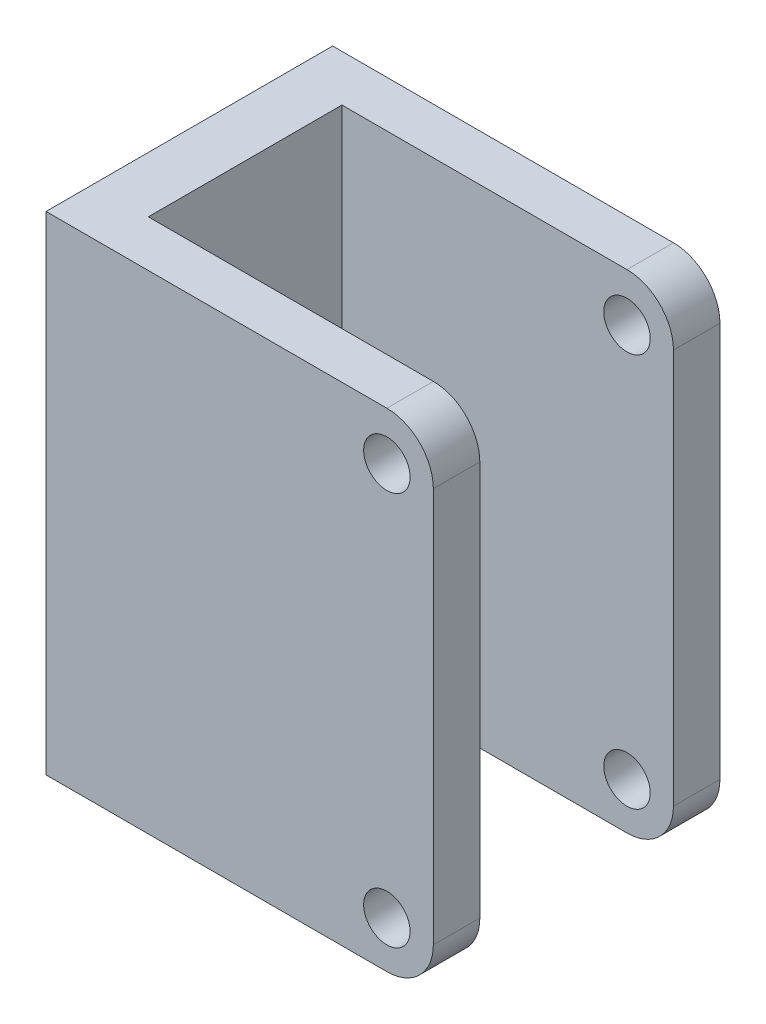
ISO-10303-21;
HEADER;
FILE_DESCRIPTION(('STEP AP214'),'2;1');
FILE_NAME('part.step','',(''),(''),'','','');
FILE_SCHEMA(('AUTOMOTIVE_DESIGN { 1 0 10303 214 1 1 1 1 }'));
ENDSEC;
DATA;
#1=APPLICATION_CONTEXT('core data for automotive mechanical design processes');
#2=APPLICATION_PROTOCOL_DEFINITION('international standard','automotive_design',2000,#1);
#3=PRODUCT_CONTEXT('',#1,'mechanical');
#4=PRODUCT('Part','Part','',(#3));
#5=PRODUCT_RELATED_PRODUCT_CATEGORY('part','',(#4));
#6=PRODUCT_DEFINITION_FORMATION('','',#4);
#7=PRODUCT_DEFINITION_CONTEXT('part definition',#1,'design');
#8=PRODUCT_DEFINITION('design','',#6,#7);
#9=PRODUCT_DEFINITION_SHAPE('','',#8);
#10=(LENGTH_UNIT() NAMED_UNIT(*) SI_UNIT(.MILLI.,.METRE.));
#11=(NAMED_UNIT(*) PLANE_ANGLE_UNIT() SI_UNIT($,.RADIAN.));
#12=(NAMED_UNIT(*) SI_UNIT($,.STERADIAN.) SOLID_ANGLE_UNIT());
#13=UNCERTAINTY_MEASURE_WITH_UNIT(LENGTH_MEASURE(1.E-05),#10,'distance_accuracy_value','');
#14=(GEOMETRIC_REPRESENTATION_CONTEXT(3) GLOBAL_UNCERTAINTY_ASSIGNED_CONTEXT((#13)) GLOBAL_UNIT_ASSIGNED_CONTEXT((#10,
#11,#12)) REPRESENTATION_CONTEXT('',''));
#15=CARTESIAN_POINT('',(0.,0.,0.));
#16=DIRECTION('',(0.,0.,1.));
#17=DIRECTION('',(1.,0.,0.));
#18=AXIS2_PLACEMENT_3D('',#15,#16,#17);
#19=CARTESIAN_POINT('',(-18.4575144066164,-16.4787543655413,12.0000000000001));
#20=DIRECTION('',(0.,0.,1.));
#21=DIRECTION('',(1.,0.,0.));
#22=AXIS2_PLACEMENT_3D('',#19,#20,#21);
#23=PLANE('',#22);
#24=CARTESIAN_POINT('',(-18.4575144066164,-16.4787543655413,12.0000000000001));
#25=DIRECTION('',(0.,0.,1.));
#26=DIRECTION('',(1.,0.,0.));
#27=AXIS2_PLACEMENT_3D('',#24,#25,#26);
#28=CIRCLE('',#27,3.);
#29=CARTESIAN_POINT('',(-18.4575144066164,-19.4787543655413,12.0000000000001));
#30=VERTEX_POINT('',#29);
#31=CARTESIAN_POINT('',(-15.4575144066164,-16.4787543655413,12.0000000000001));
#32=VERTEX_POINT('',#31);
#33=EDGE_CURVE('E129',#30,#32,#28,.T.);
#34=ORIENTED_EDGE('',*,*,#33,.F.);
#35=DIRECTION('',(1.,0.,0.));
#36=VECTOR('',#35,1.);
#37=CARTESIAN_POINT('',(-40.4575144066164,-19.4787543655413,12.0000000000001));
#38=LINE('',#37,#36);
#39=CARTESIAN_POINT('',(-36.8575144066164,-19.4787543655413,12.0000000000001));
#40=VERTEX_POINT('',#39);
#41=EDGE_CURVE('E127',#40,#30,#38,.T.);
#42=ORIENTED_EDGE('',*,*,#41,.F.);
#43=DIRECTION('',(0.,-1.,0.));
#44=VECTOR('',#43,1.);
#45=CARTESIAN_POINT('',(-36.8575144066164,-19.4787543655413,12.0000000000001));
#46=LINE('',#45,#44);
#47=CARTESIAN_POINT('',(-36.8575144066164,12.0212456344587,12.0000000000001));
#48=VERTEX_POINT('',#47);
#49=EDGE_CURVE('E148',#48,#40,#46,.T.);
#50=ORIENTED_EDGE('',*,*,#49,.F.);
#51=DIRECTION('',(-1.,0.,0.));
#52=VECTOR('',#51,1.);
#53=CARTESIAN_POINT('',(-18.4575144066164,12.0212456344587,12.0000000000001));
#54=LINE('',#53,#52);
#55=CARTESIAN_POINT('',(-18.4575144066164,12.0212456344587,12.0000000000001));
#56=VERTEX_POINT('',#55);
#57=EDGE_CURVE('E55',#56,#48,#54,.T.);
#58=ORIENTED_EDGE('',*,*,#57,.F.);
#59=CARTESIAN_POINT('',(-18.4575144066163,9.02124563445868,12.0000000000001));
#60=DIRECTION('',(0.,0.,1.));
#61=DIRECTION('',(1.,0.,0.));
#62=AXIS2_PLACEMENT_3D('',#59,#60,#61);
#63=CIRCLE('',#62,3.);
#64=CARTESIAN_POINT('',(-15.4575144066163,9.02124563445866,12.0000000000001));
#65=VERTEX_POINT('',#64);
#66=EDGE_CURVE('E86',#65,#56,#63,.T.);
#67=ORIENTED_EDGE('',*,*,#66,.F.);
#68=DIRECTION('',(0.,1.,0.));
#69=VECTOR('',#68,1.);
#70=CARTESIAN_POINT('',(-15.4575144066164,-16.4787543655413,12.0000000000001));
#71=LINE('',#70,#69);
#72=EDGE_CURVE('E117',#32,#65,#71,.T.);
#73=ORIENTED_EDGE('',*,*,#72,.F.);
#74=EDGE_LOOP('',(#34,#42,#50,#58,#67,#73));
#75=FACE_BOUND('',#74,.T.);
#76=CARTESIAN_POINT('',(-18.4575144066163,-16.4787543655413,12.0000000000001));
#77=DIRECTION('',(0.,0.,1.));
#78=DIRECTION('',(1.,0.,0.));
#79=AXIS2_PLACEMENT_3D('',#76,#77,#78);
#80=CIRCLE('',#79,1.5);
#81=CARTESIAN_POINT('',(-16.9575144066163,-16.4787543655413,12.0000000000001));
#82=VERTEX_POINT('',#81);
#83=EDGE_CURVE('E170',#82,#82,#80,.T.);
#84=ORIENTED_EDGE('',*,*,#83,.T.);
#85=EDGE_LOOP('',(#84));
#86=FACE_BOUND('',#85,.T.);
#87=CARTESIAN_POINT('',(-18.4575144066163,8.92124563445868,12.0000000000001));
#88=DIRECTION('',(0.,0.,1.));
#89=DIRECTION('',(1.,0.,0.));
#90=AXIS2_PLACEMENT_3D('',#87,#88,#89);
#91=CIRCLE('',#90,1.5);
#92=CARTESIAN_POINT('',(-16.9575144066163,8.92124563445868,12.0000000000001));
#93=VERTEX_POINT('',#92);
#94=EDGE_CURVE('E152',#93,#93,#91,.T.);
#95=ORIENTED_EDGE('',*,*,#94,.T.);
#96=EDGE_LOOP('',(#95));
#97=FACE_BOUND('',#96,.T.);
#98=ADVANCED_FACE('F40',(#75,#86,#97),#23,.F.);
#99=CARTESIAN_POINT('',(-18.4575144066164,-16.4787543655413,15.0000000000001));
#100=DIRECTION('',(0.,0.,1.));
#101=DIRECTION('',(1.,0.,0.));
#102=AXIS2_PLACEMENT_3D('',#99,#100,#101);
#103=PLANE('',#102);
#104=CARTESIAN_POINT('',(-18.4575144066163,-16.4787543655413,15.0000000000001));
#105=DIRECTION('',(0.,0.,1.));
#106=DIRECTION('',(1.,0.,0.));
#107=AXIS2_PLACEMENT_3D('',#104,#105,#106);
#108=CIRCLE('',#107,1.5);
#109=CARTESIAN_POINT('',(-16.9575144066163,-16.4787543655413,15.0000000000001));
#110=VERTEX_POINT('',#109);
#111=EDGE_CURVE('E130',#110,#110,#108,.T.);
#112=ORIENTED_EDGE('',*,*,#111,.F.);
#113=EDGE_LOOP('',(#112));
#114=FACE_BOUND('',#113,.T.);
#115=DIRECTION('',(0.,-1.,0.));
#116=VECTOR('',#115,1.);
#117=CARTESIAN_POINT('',(-40.4575144066164,12.0212456344587,15.0000000000001));
#118=LINE('',#117,#116);
#119=CARTESIAN_POINT('',(-40.4575144066164,12.0212456344587,15.0000000000001));
#120=VERTEX_POINT('',#119);
#121=CARTESIAN_POINT('',(-40.4575144066164,-19.4787543655413,15.0000000000001));
#122=VERTEX_POINT('',#121);
#123=EDGE_CURVE('E135',#120,#122,#118,.T.);
#124=ORIENTED_EDGE('',*,*,#123,.T.);
#125=DIRECTION('',(1.,0.,0.));
#126=VECTOR('',#125,1.);
#127=CARTESIAN_POINT('',(-40.4575144066164,-19.4787543655413,15.0000000000001));
#128=LINE('',#127,#126);
#129=CARTESIAN_POINT('',(-18.4575144066164,-19.4787543655413,15.0000000000001));
#130=VERTEX_POINT('',#129);
#131=EDGE_CURVE('E93',#122,#130,#128,.T.);
#132=ORIENTED_EDGE('',*,*,#131,.T.);
#133=CARTESIAN_POINT('',(-18.4575144066164,-16.4787543655413,15.0000000000001));
#134=DIRECTION('',(0.,0.,1.));
#135=DIRECTION('',(1.,0.,0.));
#136=AXIS2_PLACEMENT_3D('',#133,#134,#135);
#137=CIRCLE('',#136,3.);
#138=CARTESIAN_POINT('',(-15.4575144066164,-16.4787543655413,15.0000000000001));
#139=VERTEX_POINT('',#138);
#140=EDGE_CURVE('E109',#130,#139,#137,.T.);
#141=ORIENTED_EDGE('',*,*,#140,.T.);
#142=DIRECTION('',(0.,1.,0.));
#143=VECTOR('',#142,1.);
#144=CARTESIAN_POINT('',(-15.4575144066164,-16.4787543655413,15.0000000000001));
#145=LINE('',#144,#143);
#146=CARTESIAN_POINT('',(-15.4575144066163,9.02124563445866,15.0000000000001));
#147=VERTEX_POINT('',#146);
#148=EDGE_CURVE('E102',#139,#147,#145,.T.);
#149=ORIENTED_EDGE('',*,*,#148,.T.);
#150=CARTESIAN_POINT('',(-18.4575144066163,9.02124563445868,15.0000000000001));
#151=DIRECTION('',(0.,0.,1.));
#152=DIRECTION('',(1.,0.,0.));
#153=AXIS2_PLACEMENT_3D('',#150,#151,#152);
#154=CIRCLE('',#153,3.);
#155=CARTESIAN_POINT('',(-18.4575144066164,12.0212456344587,15.0000000000001));
#156=VERTEX_POINT('',#155);
#157=EDGE_CURVE('E107',#147,#156,#154,.T.);
#158=ORIENTED_EDGE('',*,*,#157,.T.);
#159=DIRECTION('',(-1.,0.,0.));
#160=VECTOR('',#159,1.);
#161=CARTESIAN_POINT('',(-18.4575144066164,12.0212456344587,15.0000000000001));
#162=LINE('',#161,#160);
#163=EDGE_CURVE('E64',#156,#120,#162,.T.);
#164=ORIENTED_EDGE('',*,*,#163,.T.);
#165=EDGE_LOOP('',(#124,#132,#141,#149,#158,#164));
#166=FACE_BOUND('',#165,.T.);
#167=CARTESIAN_POINT('',(-18.4575144066163,8.92124563445868,15.0000000000001));
#168=DIRECTION('',(0.,0.,1.));
#169=DIRECTION('',(1.,0.,0.));
#170=AXIS2_PLACEMENT_3D('',#167,#168,#169);
#171=CIRCLE('',#170,1.5);
#172=CARTESIAN_POINT('',(-16.9575144066163,8.92124563445868,15.0000000000001));
#173=VERTEX_POINT('',#172);
#174=EDGE_CURVE('E167',#173,#173,#171,.T.);
#175=ORIENTED_EDGE('',*,*,#174,.F.);
#176=EDGE_LOOP('',(#175));
#177=FACE_BOUND('',#176,.T.);
#178=ADVANCED_FACE('F104',(#114,#166,#177),#103,.T.);
#179=CARTESIAN_POINT('',(-40.4575144066164,12.0212456344587,15.0000000000001));
#180=DIRECTION('',(1.,0.,0.));
#181=DIRECTION('',(0.,0.,-1.));
#182=AXIS2_PLACEMENT_3D('',#179,#180,#181);
#183=PLANE('',#182);
#184=DIRECTION('',(0.,0.,-1.));
#185=VECTOR('',#184,1.);
#186=CARTESIAN_POINT('',(-40.4575144066164,12.0212456344587,15.0000000000001));
#187=LINE('',#186,#185);
#188=CARTESIAN_POINT('',(-40.4575144066164,12.0212456344587,-3.49999999999986));
#189=VERTEX_POINT('',#188);
#190=EDGE_CURVE('E123',#120,#189,#187,.T.);
#191=ORIENTED_EDGE('',*,*,#190,.T.);
#192=DIRECTION('',(0.,-1.,0.));
#193=VECTOR('',#192,1.);
#194=CARTESIAN_POINT('',(-40.4575144066164,12.0212456344587,-3.49999999999986));
#195=LINE('',#194,#193);
#196=CARTESIAN_POINT('',(-40.4575144066164,-19.4787543655413,-3.49999999999986));
#197=VERTEX_POINT('',#196);
#198=EDGE_CURVE('E184',#189,#197,#195,.T.);
#199=ORIENTED_EDGE('',*,*,#198,.T.);
#200=DIRECTION('',(0.,0.,-1.));
#201=VECTOR('',#200,1.);
#202=CARTESIAN_POINT('',(-40.4575144066164,-19.4787543655413,15.0000000000001));
#203=LINE('',#202,#201);
#204=EDGE_CURVE('E11',#122,#197,#203,.T.);
#205=ORIENTED_EDGE('',*,*,#204,.F.);
#206=ORIENTED_EDGE('',*,*,#123,.F.);
#207=EDGE_LOOP('',(#191,#199,#205,#206));
#208=FACE_BOUND('',#207,.T.);
#209=ADVANCED_FACE('F42',(#208),#183,.F.);
#210=CARTESIAN_POINT('',(-40.4575144066164,-19.4787543655413,15.0000000000001));
#211=DIRECTION('',(0.,1.,0.));
#212=DIRECTION('',(0.,0.,1.));
#213=AXIS2_PLACEMENT_3D('',#210,#211,#212);
#214=PLANE('',#213);
#215=ORIENTED_EDGE('',*,*,#204,.T.);
#216=DIRECTION('',(1.,0.,0.));
#217=VECTOR('',#216,1.);
#218=CARTESIAN_POINT('',(-40.4575144066164,-19.4787543655413,-3.49999999999986));
#219=LINE('',#218,#217);
#220=CARTESIAN_POINT('',(-18.4575144066164,-19.4787543655413,-3.49999999999986));
#221=VERTEX_POINT('',#220);
#222=EDGE_CURVE('E190',#197,#221,#219,.T.);
#223=ORIENTED_EDGE('',*,*,#222,.T.);
#224=DIRECTION('',(0.,0.,1.));
#225=VECTOR('',#224,1.);
#226=CARTESIAN_POINT('',(-18.4575144066164,-19.4787543655413,-3.49999999999986));
#227=LINE('',#226,#225);
#228=CARTESIAN_POINT('',(-18.4575144066164,-19.4787543655413,-0.499999999999865));
#229=VERTEX_POINT('',#228);
#230=EDGE_CURVE('E216',#221,#229,#227,.T.);
#231=ORIENTED_EDGE('',*,*,#230,.T.);
#232=DIRECTION('',(1.,0.,0.));
#233=VECTOR('',#232,1.);
#234=CARTESIAN_POINT('',(-40.4575144066164,-19.4787543655413,-0.499999999999865));
#235=LINE('',#234,#233);
#236=CARTESIAN_POINT('',(-36.8575144066164,-19.4787543655413,-0.499999999999865));
#237=VERTEX_POINT('',#236);
#238=EDGE_CURVE('E217',#237,#229,#235,.T.);
#239=ORIENTED_EDGE('',*,*,#238,.F.);
#240=DIRECTION('',(0.,0.,1.));
#241=VECTOR('',#240,1.);
#242=CARTESIAN_POINT('',(-36.8575144066164,-19.4787543655413,-500000.));
#243=LINE('',#242,#241);
#244=EDGE_CURVE('E153',#237,#40,#243,.T.);
#245=ORIENTED_EDGE('',*,*,#244,.T.);
#246=ORIENTED_EDGE('',*,*,#41,.T.);
#247=DIRECTION('',(0.,0.,-1.));
#248=VECTOR('',#247,1.);
#249=CARTESIAN_POINT('',(-18.4575144066164,-19.4787543655413,15.0000000000001));
#250=LINE('',#249,#248);
#251=EDGE_CURVE('E48',#130,#30,#250,.T.);
#252=ORIENTED_EDGE('',*,*,#251,.F.);
#253=ORIENTED_EDGE('',*,*,#131,.F.);
#254=EDGE_LOOP('',(#215,#223,#231,#239,#245,#246,#252,#253));
#255=FACE_BOUND('',#254,.T.);
#256=ADVANCED_FACE('F187',(#255),#214,.F.);
#257=CARTESIAN_POINT('',(-18.4575144066164,-16.4787543655413,15.0000000000001));
#258=DIRECTION('',(0.,0.,-1.));
#259=DIRECTION('',(-1.,0.,0.));
#260=AXIS2_PLACEMENT_3D('',#257,#258,#259);
#261=CYLINDRICAL_SURFACE('',#260,3.);
#262=ORIENTED_EDGE('',*,*,#33,.T.);
#263=DIRECTION('',(0.,0.,-1.));
#264=VECTOR('',#263,1.);
#265=CARTESIAN_POINT('',(-15.4575144066164,-16.4787543655413,15.0000000000001));
#266=LINE('',#265,#264);
#267=EDGE_CURVE('E118',#139,#32,#266,.T.);
#268=ORIENTED_EDGE('',*,*,#267,.F.);
#269=ORIENTED_EDGE('',*,*,#140,.F.);
#270=ORIENTED_EDGE('',*,*,#251,.T.);
#271=EDGE_LOOP('',(#262,#268,#269,#270));
#272=FACE_BOUND('',#271,.T.);
#273=ADVANCED_FACE('F142',(#272),#261,.T.);
#274=CARTESIAN_POINT('',(-15.4575144066164,-16.4787543655413,15.0000000000001));
#275=DIRECTION('',(-1.,0.,0.));
#276=DIRECTION('',(0.,-1.,0.));
#277=AXIS2_PLACEMENT_3D('',#274,#275,#276);
#278=PLANE('',#277);
#279=ORIENTED_EDGE('',*,*,#72,.T.);
#280=DIRECTION('',(0.,0.,-1.));
#281=VECTOR('',#280,1.);
#282=CARTESIAN_POINT('',(-15.4575144066163,9.02124563445866,15.0000000000001));
#283=LINE('',#282,#281);
#284=EDGE_CURVE('E114',#147,#65,#283,.T.);
#285=ORIENTED_EDGE('',*,*,#284,.F.);
#286=ORIENTED_EDGE('',*,*,#148,.F.);
#287=ORIENTED_EDGE('',*,*,#267,.T.);
#288=EDGE_LOOP('',(#279,#285,#286,#287));
#289=FACE_BOUND('',#288,.T.);
#290=ADVANCED_FACE('F115',(#289),#278,.F.);
#291=CARTESIAN_POINT('',(-18.4575144066163,9.02124563445868,15.0000000000001));
#292=DIRECTION('',(0.,0.,-1.));
#293=DIRECTION('',(-1.,0.,0.));
#294=AXIS2_PLACEMENT_3D('',#291,#292,#293);
#295=CYLINDRICAL_SURFACE('',#294,3.);
#296=ORIENTED_EDGE('',*,*,#66,.T.);
#297=DIRECTION('',(0.,0.,-1.));
#298=VECTOR('',#297,1.);
#299=CARTESIAN_POINT('',(-18.4575144066164,12.0212456344587,15.0000000000001));
#300=LINE('',#299,#298);
#301=EDGE_CURVE('E119',#156,#56,#300,.T.);
#302=ORIENTED_EDGE('',*,*,#301,.F.);
#303=ORIENTED_EDGE('',*,*,#157,.F.);
#304=ORIENTED_EDGE('',*,*,#284,.T.);
#305=EDGE_LOOP('',(#296,#302,#303,#304));
#306=FACE_BOUND('',#305,.T.);
#307=ADVANCED_FACE('F121',(#306),#295,.T.);
#308=CARTESIAN_POINT('',(-18.4575144066164,12.0212456344587,15.0000000000001));
#309=DIRECTION('',(0.,-1.,0.));
#310=DIRECTION('',(1.,0.,0.));
#311=AXIS2_PLACEMENT_3D('',#308,#309,#310);
#312=PLANE('',#311);
#313=ORIENTED_EDGE('',*,*,#57,.T.);
#314=DIRECTION('',(0.,0.,1.));
#315=VECTOR('',#314,1.);
#316=CARTESIAN_POINT('',(-36.8575144066164,12.0212456344587,-500000.));
#317=LINE('',#316,#315);
#318=CARTESIAN_POINT('',(-36.8575144066164,12.0212456344587,-0.499999999988177));
#319=VERTEX_POINT('',#318);
#320=EDGE_CURVE('E156',#319,#48,#317,.T.);
#321=ORIENTED_EDGE('',*,*,#320,.F.);
#322=DIRECTION('',(-1.,0.,0.));
#323=VECTOR('',#322,1.);
#324=CARTESIAN_POINT('',(-18.4575144066164,12.0212456344587,-0.499999999999865));
#325=LINE('',#324,#323);
#326=CARTESIAN_POINT('',(-18.4575144066164,12.0212456344587,-0.499999999999865));
#327=VERTEX_POINT('',#326);
#328=EDGE_CURVE('E205',#327,#319,#325,.T.);
#329=ORIENTED_EDGE('',*,*,#328,.F.);
#330=DIRECTION('',(0.,0.,1.));
#331=VECTOR('',#330,1.);
#332=CARTESIAN_POINT('',(-18.4575144066164,12.0212456344587,-3.49999999999986));
#333=LINE('',#332,#331);
#334=CARTESIAN_POINT('',(-18.4575144066164,12.0212456344587,-3.49999999999986));
#335=VERTEX_POINT('',#334);
#336=EDGE_CURVE('E164',#335,#327,#333,.T.);
#337=ORIENTED_EDGE('',*,*,#336,.F.);
#338=DIRECTION('',(-1.,0.,0.));
#339=VECTOR('',#338,1.);
#340=CARTESIAN_POINT('',(-18.4575144066164,12.0212456344587,-3.49999999999986));
#341=LINE('',#340,#339);
#342=EDGE_CURVE('E214',#335,#189,#341,.T.);
#343=ORIENTED_EDGE('',*,*,#342,.T.);
#344=ORIENTED_EDGE('',*,*,#190,.F.);
#345=ORIENTED_EDGE('',*,*,#163,.F.);
#346=ORIENTED_EDGE('',*,*,#301,.T.);
#347=EDGE_LOOP('',(#313,#321,#329,#337,#343,#344,#345,#346));
#348=FACE_BOUND('',#347,.T.);
#349=ADVANCED_FACE('F261',(#348),#312,.F.);
#350=CARTESIAN_POINT('',(-18.4575144066163,-16.4787543655413,15.0000000000001));
#351=DIRECTION('',(0.,0.,-1.));
#352=DIRECTION('',(-1.,0.,0.));
#353=AXIS2_PLACEMENT_3D('',#350,#351,#352);
#354=CYLINDRICAL_SURFACE('',#353,1.5);
#355=ORIENTED_EDGE('',*,*,#111,.T.);
#356=EDGE_LOOP('',(#355));
#357=FACE_BOUND('',#356,.T.);
#358=ORIENTED_EDGE('',*,*,#83,.F.);
#359=EDGE_LOOP('',(#358));
#360=FACE_BOUND('',#359,.T.);
#361=ADVANCED_FACE('F295',(#357,#360),#354,.F.);
#362=CARTESIAN_POINT('',(-18.4575144066163,8.92124563445868,15.0000000000001));
#363=DIRECTION('',(0.,0.,-1.));
#364=DIRECTION('',(-1.,0.,0.));
#365=AXIS2_PLACEMENT_3D('',#362,#363,#364);
#366=CYLINDRICAL_SURFACE('',#365,1.5);
#367=ORIENTED_EDGE('',*,*,#174,.T.);
#368=EDGE_LOOP('',(#367));
#369=FACE_BOUND('',#368,.T.);
#370=ORIENTED_EDGE('',*,*,#94,.F.);
#371=EDGE_LOOP('',(#370));
#372=FACE_BOUND('',#371,.T.);
#373=ADVANCED_FACE('F314',(#369,#372),#366,.F.);
#374=CARTESIAN_POINT('',(-36.8575144066164,-19.4787543655413,-500000.));
#375=DIRECTION('',(-1.,0.,0.));
#376=DIRECTION('',(0.,0.,1.));
#377=AXIS2_PLACEMENT_3D('',#374,#375,#376);
#378=PLANE('',#377);
#379=ORIENTED_EDGE('',*,*,#244,.F.);
#380=DIRECTION('',(0.,1.,0.));
#381=VECTOR('',#380,1.);
#382=CARTESIAN_POINT('',(-36.8575144066164,-19.4787543655413,-0.499999999988177));
#383=LINE('',#382,#381);
#384=EDGE_CURVE('E160',#237,#319,#383,.T.);
#385=ORIENTED_EDGE('',*,*,#384,.T.);
#386=ORIENTED_EDGE('',*,*,#320,.T.);
#387=ORIENTED_EDGE('',*,*,#49,.T.);
#388=EDGE_LOOP('',(#379,#385,#386,#387));
#389=FACE_BOUND('',#388,.T.);
#390=ADVANCED_FACE('F157',(#389),#378,.F.);
#391=CARTESIAN_POINT('',(-18.4575144066164,-16.4787543655413,-0.499999999999865));
#392=DIRECTION('',(0.,0.,1.));
#393=DIRECTION('',(1.,0.,0.));
#394=AXIS2_PLACEMENT_3D('',#391,#392,#393);
#395=PLANE('',#394);
#396=CARTESIAN_POINT('',(-18.4575144066163,-16.4787543655413,-0.499999999999865));
#397=DIRECTION('',(0.,0.,1.));
#398=DIRECTION('',(1.,0.,0.));
#399=AXIS2_PLACEMENT_3D('',#396,#397,#398);
#400=CIRCLE('',#399,1.5);
#401=CARTESIAN_POINT('',(-16.9575144066163,-16.4787543655413,-0.499999999999865));
#402=VERTEX_POINT('',#401);
#403=EDGE_CURVE('E458',#402,#402,#400,.T.);
#404=ORIENTED_EDGE('',*,*,#403,.F.);
#405=EDGE_LOOP('',(#404));
#406=FACE_BOUND('',#405,.T.);
#407=CARTESIAN_POINT('',(-18.4575144066163,8.92124563445868,-0.499999999999865));
#408=DIRECTION('',(0.,0.,1.));
#409=DIRECTION('',(1.,0.,0.));
#410=AXIS2_PLACEMENT_3D('',#407,#408,#409);
#411=CIRCLE('',#410,1.5);
#412=CARTESIAN_POINT('',(-16.9575144066163,8.92124563445868,-0.499999999999865));
#413=VERTEX_POINT('',#412);
#414=EDGE_CURVE('E455',#413,#413,#411,.T.);
#415=ORIENTED_EDGE('',*,*,#414,.F.);
#416=EDGE_LOOP('',(#415));
#417=FACE_BOUND('',#416,.T.);
#418=ORIENTED_EDGE('',*,*,#384,.F.);
#419=ORIENTED_EDGE('',*,*,#238,.T.);
#420=CARTESIAN_POINT('',(-18.4575144066164,-16.4787543655413,-0.499999999999865));
#421=DIRECTION('',(0.,0.,1.));
#422=DIRECTION('',(1.,0.,0.));
#423=AXIS2_PLACEMENT_3D('',#420,#421,#422);
#424=CIRCLE('',#423,3.);
#425=CARTESIAN_POINT('',(-15.4575144066164,-16.4787543655413,-0.499999999999865));
#426=VERTEX_POINT('',#425);
#427=EDGE_CURVE('E220',#229,#426,#424,.T.);
#428=ORIENTED_EDGE('',*,*,#427,.T.);
#429=DIRECTION('',(0.,1.,0.));
#430=VECTOR('',#429,1.);
#431=CARTESIAN_POINT('',(-15.4575144066164,-16.4787543655413,-0.499999999999865));
#432=LINE('',#431,#430);
#433=CARTESIAN_POINT('',(-15.4575144066163,9.02124563445866,-0.499999999999865));
#434=VERTEX_POINT('',#433);
#435=EDGE_CURVE('E224',#426,#434,#432,.T.);
#436=ORIENTED_EDGE('',*,*,#435,.T.);
#437=CARTESIAN_POINT('',(-18.4575144066163,9.02124563445868,-0.499999999999865));
#438=DIRECTION('',(0.,0.,1.));
#439=DIRECTION('',(1.,0.,0.));
#440=AXIS2_PLACEMENT_3D('',#437,#438,#439);
#441=CIRCLE('',#440,3.);
#442=EDGE_CURVE('E227',#434,#327,#441,.T.);
#443=ORIENTED_EDGE('',*,*,#442,.T.);
#444=ORIENTED_EDGE('',*,*,#328,.T.);
#445=EDGE_LOOP('',(#418,#419,#428,#436,#443,#444));
#446=FACE_BOUND('',#445,.T.);
#447=ADVANCED_FACE('F252',(#406,#417,#446),#395,.T.);
#448=CARTESIAN_POINT('',(-18.4575144066163,9.02124563445868,-3.49999999999986));
#449=DIRECTION('',(0.,0.,1.));
#450=DIRECTION('',(1.,0.,0.));
#451=AXIS2_PLACEMENT_3D('',#448,#449,#450);
#452=CYLINDRICAL_SURFACE('',#451,3.);
#453=ORIENTED_EDGE('',*,*,#442,.F.);
#454=DIRECTION('',(0.,0.,1.));
#455=VECTOR('',#454,1.);
#456=CARTESIAN_POINT('',(-15.4575144066163,9.02124563445866,-3.49999999999986));
#457=LINE('',#456,#455);
#458=CARTESIAN_POINT('',(-15.4575144066163,9.02124563445866,-3.49999999999986));
#459=VERTEX_POINT('',#458);
#460=EDGE_CURVE('E234',#459,#434,#457,.T.);
#461=ORIENTED_EDGE('',*,*,#460,.F.);
#462=CARTESIAN_POINT('',(-18.4575144066163,9.02124563445868,-3.49999999999986));
#463=DIRECTION('',(0.,0.,1.));
#464=DIRECTION('',(1.,0.,0.));
#465=AXIS2_PLACEMENT_3D('',#462,#463,#464);
#466=CIRCLE('',#465,3.);
#467=EDGE_CURVE('E211',#459,#335,#466,.T.);
#468=ORIENTED_EDGE('',*,*,#467,.T.);
#469=ORIENTED_EDGE('',*,*,#336,.T.);
#470=EDGE_LOOP('',(#453,#461,#468,#469));
#471=FACE_BOUND('',#470,.T.);
#472=ADVANCED_FACE('F268',(#471),#452,.T.);
#473=CARTESIAN_POINT('',(-15.4575144066164,-16.4787543655413,-3.49999999999986));
#474=DIRECTION('',(1.,0.,0.));
#475=DIRECTION('',(0.,1.,0.));
#476=AXIS2_PLACEMENT_3D('',#473,#474,#475);
#477=PLANE('',#476);
#478=ORIENTED_EDGE('',*,*,#435,.F.);
#479=DIRECTION('',(0.,0.,1.));
#480=VECTOR('',#479,1.);
#481=CARTESIAN_POINT('',(-15.4575144066164,-16.4787543655413,-3.49999999999986));
#482=LINE('',#481,#480);
#483=CARTESIAN_POINT('',(-15.4575144066164,-16.4787543655413,-3.49999999999986));
#484=VERTEX_POINT('',#483);
#485=EDGE_CURVE('E237',#484,#426,#482,.T.);
#486=ORIENTED_EDGE('',*,*,#485,.F.);
#487=DIRECTION('',(0.,1.,0.));
#488=VECTOR('',#487,1.);
#489=CARTESIAN_POINT('',(-15.4575144066164,-16.4787543655413,-3.49999999999986));
#490=LINE('',#489,#488);
#491=EDGE_CURVE('E203',#484,#459,#490,.T.);
#492=ORIENTED_EDGE('',*,*,#491,.T.);
#493=ORIENTED_EDGE('',*,*,#460,.T.);
#494=EDGE_LOOP('',(#478,#486,#492,#493));
#495=FACE_BOUND('',#494,.T.);
#496=ADVANCED_FACE('F272',(#495),#477,.T.);
#497=CARTESIAN_POINT('',(-18.4575144066164,-16.4787543655413,-3.49999999999986));
#498=DIRECTION('',(0.,0.,1.));
#499=DIRECTION('',(1.,0.,0.));
#500=AXIS2_PLACEMENT_3D('',#497,#498,#499);
#501=CYLINDRICAL_SURFACE('',#500,3.);
#502=ORIENTED_EDGE('',*,*,#427,.F.);
#503=ORIENTED_EDGE('',*,*,#230,.F.);
#504=CARTESIAN_POINT('',(-18.4575144066164,-16.4787543655413,-3.49999999999986));
#505=DIRECTION('',(0.,0.,1.));
#506=DIRECTION('',(1.,0.,0.));
#507=AXIS2_PLACEMENT_3D('',#504,#505,#506);
#508=CIRCLE('',#507,3.);
#509=EDGE_CURVE('E201',#221,#484,#508,.T.);
#510=ORIENTED_EDGE('',*,*,#509,.T.);
#511=ORIENTED_EDGE('',*,*,#485,.T.);
#512=EDGE_LOOP('',(#502,#503,#510,#511));
#513=FACE_BOUND('',#512,.T.);
#514=ADVANCED_FACE('F248',(#513),#501,.T.);
#515=CARTESIAN_POINT('',(-18.4575144066164,-16.4787543655413,-3.49999999999986));
#516=DIRECTION('',(0.,0.,1.));
#517=DIRECTION('',(1.,0.,0.));
#518=AXIS2_PLACEMENT_3D('',#515,#516,#517);
#519=PLANE('',#518);
#520=CARTESIAN_POINT('',(-18.4575144066163,8.92124563445868,-3.49999999999986));
#521=DIRECTION('',(0.,0.,1.));
#522=DIRECTION('',(1.,0.,0.));
#523=AXIS2_PLACEMENT_3D('',#520,#521,#522);
#524=CIRCLE('',#523,1.5);
#525=CARTESIAN_POINT('',(-16.9575144066163,8.92124563445868,-3.49999999999986));
#526=VERTEX_POINT('',#525);
#527=EDGE_CURVE('E452',#526,#526,#524,.T.);
#528=ORIENTED_EDGE('',*,*,#527,.T.);
#529=EDGE_LOOP('',(#528));
#530=FACE_BOUND('',#529,.T.);
#531=CARTESIAN_POINT('',(-18.4575144066163,-16.4787543655413,-3.49999999999986));
#532=DIRECTION('',(0.,0.,1.));
#533=DIRECTION('',(1.,0.,0.));
#534=AXIS2_PLACEMENT_3D('',#531,#532,#533);
#535=CIRCLE('',#534,1.5);
#536=CARTESIAN_POINT('',(-16.9575144066163,-16.4787543655413,-3.49999999999986));
#537=VERTEX_POINT('',#536);
#538=EDGE_CURVE('E221',#537,#537,#535,.T.);
#539=ORIENTED_EDGE('',*,*,#538,.T.);
#540=EDGE_LOOP('',(#539));
#541=FACE_BOUND('',#540,.T.);
#542=ORIENTED_EDGE('',*,*,#198,.F.);
#543=ORIENTED_EDGE('',*,*,#342,.F.);
#544=ORIENTED_EDGE('',*,*,#467,.F.);
#545=ORIENTED_EDGE('',*,*,#491,.F.);
#546=ORIENTED_EDGE('',*,*,#509,.F.);
#547=ORIENTED_EDGE('',*,*,#222,.F.);
#548=EDGE_LOOP('',(#542,#543,#544,#545,#546,#547));
#549=FACE_BOUND('',#548,.T.);
#550=ADVANCED_FACE('F195',(#530,#541,#549),#519,.F.);
#551=CARTESIAN_POINT('',(-18.4575144066163,-16.4787543655413,-3.49999999999986));
#552=DIRECTION('',(0.,0.,1.));
#553=DIRECTION('',(1.,0.,0.));
#554=AXIS2_PLACEMENT_3D('',#551,#552,#553);
#555=CYLINDRICAL_SURFACE('',#554,1.5);
#556=ORIENTED_EDGE('',*,*,#538,.F.);
#557=EDGE_LOOP('',(#556));
#558=FACE_BOUND('',#557,.T.);
#559=ORIENTED_EDGE('',*,*,#403,.T.);
#560=EDGE_LOOP('',(#559));
#561=FACE_BOUND('',#560,.T.);
#562=ADVANCED_FACE('F339',(#558,#561),#555,.F.);
#563=CARTESIAN_POINT('',(-18.4575144066163,8.92124563445868,-3.49999999999986));
#564=DIRECTION('',(0.,0.,1.));
#565=DIRECTION('',(1.,0.,0.));
#566=AXIS2_PLACEMENT_3D('',#563,#564,#565);
#567=CYLINDRICAL_SURFACE('',#566,1.5);
#568=ORIENTED_EDGE('',*,*,#527,.F.);
#569=EDGE_LOOP('',(#568));
#570=FACE_BOUND('',#569,.T.);
#571=ORIENTED_EDGE('',*,*,#414,.T.);
#572=EDGE_LOOP('',(#571));
#573=FACE_BOUND('',#572,.T.);
#574=ADVANCED_FACE('F348',(#570,#573),#567,.F.);
#575=CLOSED_SHELL('',(#98,#178,#209,#256,#273,#290,#307,#349,#361,#373,#390,#447,#472,#496,#514,
#550,#562,#574));
#576=MANIFOLD_SOLID_BREP('B2',#575);
#577=ADVANCED_BREP_SHAPE_REPRESENTATION('',(#18,#576),#14);
#578=SHAPE_DEFINITION_REPRESENTATION(#9,#577);
ENDSEC;
END-ISO-10303-21;
